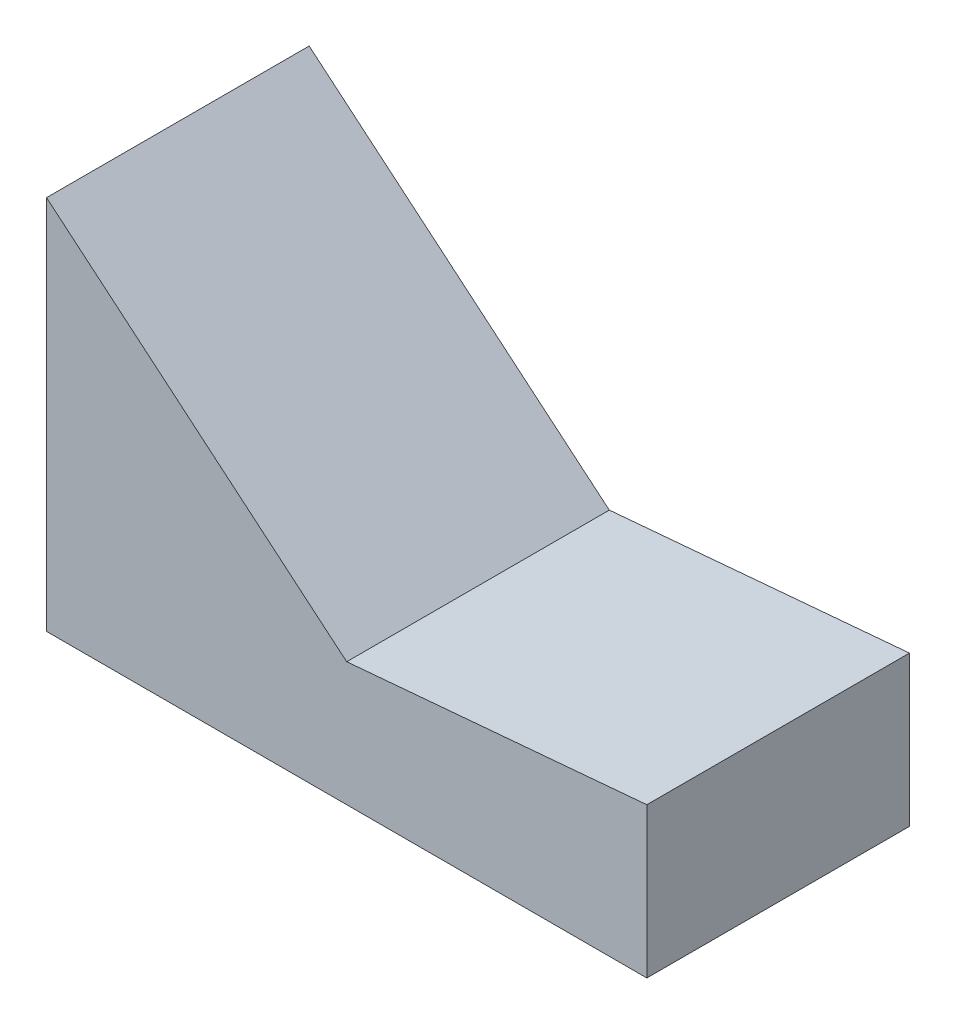
ISO-10303-21;
HEADER;
FILE_DESCRIPTION(('STEP AP214'),'2;1');
FILE_NAME('part.step','',(''),(''),'','','');
FILE_SCHEMA(('AUTOMOTIVE_DESIGN { 1 0 10303 214 1 1 1 1 }'));
ENDSEC;
DATA;
#1=APPLICATION_CONTEXT('core data for automotive mechanical design processes');
#2=APPLICATION_PROTOCOL_DEFINITION('international standard','automotive_design',2000,#1);
#3=PRODUCT_CONTEXT('',#1,'mechanical');
#4=PRODUCT('Part','Part','',(#3));
#5=PRODUCT_RELATED_PRODUCT_CATEGORY('part','',(#4));
#6=PRODUCT_DEFINITION_FORMATION('','',#4);
#7=PRODUCT_DEFINITION_CONTEXT('part definition',#1,'design');
#8=PRODUCT_DEFINITION('design','',#6,#7);
#9=PRODUCT_DEFINITION_SHAPE('','',#8);
#10=(LENGTH_UNIT() NAMED_UNIT(*) SI_UNIT(.MILLI.,.METRE.));
#11=(NAMED_UNIT(*) PLANE_ANGLE_UNIT() SI_UNIT($,.RADIAN.));
#12=(NAMED_UNIT(*) SI_UNIT($,.STERADIAN.) SOLID_ANGLE_UNIT());
#13=UNCERTAINTY_MEASURE_WITH_UNIT(LENGTH_MEASURE(1.E-05),#10,'distance_accuracy_value','');
#14=(GEOMETRIC_REPRESENTATION_CONTEXT(3) GLOBAL_UNCERTAINTY_ASSIGNED_CONTEXT((#13)) GLOBAL_UNIT_ASSIGNED_CONTEXT((#10,
#11,#12)) REPRESENTATION_CONTEXT('',''));
#15=CARTESIAN_POINT('',(0.,0.,0.));
#16=DIRECTION('',(0.,0.,1.));
#17=DIRECTION('',(1.,0.,0.));
#18=AXIS2_PLACEMENT_3D('',#15,#16,#17);
#19=CARTESIAN_POINT('',(40.,0.,17.5));
#20=DIRECTION('',(-1.,0.,0.));
#21=DIRECTION('',(0.,0.,1.));
#22=AXIS2_PLACEMENT_3D('',#19,#20,#21);
#23=PLANE('',#22);
#24=DIRECTION('',(0.,1.,0.));
#25=VECTOR('',#24,1.);
#26=CARTESIAN_POINT('',(40.,0.,-17.5));
#27=LINE('',#26,#25);
#28=CARTESIAN_POINT('',(40.,0.,-17.5));
#29=VERTEX_POINT('',#28);
#30=CARTESIAN_POINT('',(40.,20.,-17.5));
#31=VERTEX_POINT('',#30);
#32=EDGE_CURVE('E107',#29,#31,#27,.T.);
#33=ORIENTED_EDGE('',*,*,#32,.T.);
#34=DIRECTION('',(0.,0.,-1.));
#35=VECTOR('',#34,1.);
#36=CARTESIAN_POINT('',(40.,20.,17.5));
#37=LINE('',#36,#35);
#38=CARTESIAN_POINT('',(40.,20.,17.5));
#39=VERTEX_POINT('',#38);
#40=EDGE_CURVE('E11',#39,#31,#37,.T.);
#41=ORIENTED_EDGE('',*,*,#40,.F.);
#42=DIRECTION('',(0.,1.,0.));
#43=VECTOR('',#42,1.);
#44=CARTESIAN_POINT('',(40.,0.,17.5));
#45=LINE('',#44,#43);
#46=CARTESIAN_POINT('',(40.,0.,17.5));
#47=VERTEX_POINT('',#46);
#48=EDGE_CURVE('E115',#47,#39,#45,.T.);
#49=ORIENTED_EDGE('',*,*,#48,.F.);
#50=DIRECTION('',(0.,0.,-1.));
#51=VECTOR('',#50,1.);
#52=CARTESIAN_POINT('',(40.,0.,17.5));
#53=LINE('',#52,#51);
#54=EDGE_CURVE('E103',#47,#29,#53,.T.);
#55=ORIENTED_EDGE('',*,*,#54,.T.);
#56=EDGE_LOOP('',(#33,#41,#49,#55));
#57=FACE_BOUND('',#56,.T.);
#58=ADVANCED_FACE('F33',(#57),#23,.F.);
#59=CARTESIAN_POINT('',(40.,20.,17.5));
#60=DIRECTION('',(0.0871557427476551,-0.996194698091746,0.));
#61=DIRECTION('',(0.996194698091746,0.0871557427476551,0.));
#62=AXIS2_PLACEMENT_3D('',#59,#60,#61);
#63=PLANE('',#62);
#64=DIRECTION('',(-0.996194698091746,-0.0871557427476551,0.));
#65=VECTOR('',#64,1.);
#66=CARTESIAN_POINT('',(40.,20.,-17.5));
#67=LINE('',#66,#65);
#68=CARTESIAN_POINT('',(0.,16.5004534589632,-17.5));
#69=VERTEX_POINT('',#68);
#70=EDGE_CURVE('E110',#31,#69,#67,.T.);
#71=ORIENTED_EDGE('',*,*,#70,.T.);
#72=DIRECTION('',(0.,0.,-1.));
#73=VECTOR('',#72,1.);
#74=CARTESIAN_POINT('',(0.,16.5004534589632,17.5));
#75=LINE('',#74,#73);
#76=CARTESIAN_POINT('',(0.,16.5004534589632,17.5));
#77=VERTEX_POINT('',#76);
#78=EDGE_CURVE('E41',#77,#69,#75,.T.);
#79=ORIENTED_EDGE('',*,*,#78,.F.);
#80=DIRECTION('',(-0.996194698091746,-0.0871557427476551,0.));
#81=VECTOR('',#80,1.);
#82=CARTESIAN_POINT('',(40.,20.,17.5));
#83=LINE('',#82,#81);
#84=EDGE_CURVE('E83',#39,#77,#83,.T.);
#85=ORIENTED_EDGE('',*,*,#84,.F.);
#86=ORIENTED_EDGE('',*,*,#40,.T.);
#87=EDGE_LOOP('',(#71,#79,#85,#86));
#88=FACE_BOUND('',#87,.T.);
#89=ADVANCED_FACE('F134',(#88),#63,.F.);
#90=CARTESIAN_POINT('',(0.,16.5004534589632,17.5));
#91=DIRECTION('',(-0.642787609686538,-0.766044443118979,0.));
#92=DIRECTION('',(0.766044443118979,-0.642787609686538,0.));
#93=AXIS2_PLACEMENT_3D('',#90,#91,#92);
#94=PLANE('',#93);
#95=DIRECTION('',(-0.766044443118979,0.642787609686538,0.));
#96=VECTOR('',#95,1.);
#97=CARTESIAN_POINT('',(0.,16.5004534589632,-17.5));
#98=LINE('',#97,#96);
#99=CARTESIAN_POINT('',(-40.,50.0644387060543,-17.5));
#100=VERTEX_POINT('',#99);
#101=EDGE_CURVE('E98',#69,#100,#98,.T.);
#102=ORIENTED_EDGE('',*,*,#101,.T.);
#103=DIRECTION('',(0.,0.,-1.));
#104=VECTOR('',#103,1.);
#105=CARTESIAN_POINT('',(-40.,50.0644387060543,17.5));
#106=LINE('',#105,#104);
#107=CARTESIAN_POINT('',(-40.,50.0644387060543,17.5));
#108=VERTEX_POINT('',#107);
#109=EDGE_CURVE('E95',#108,#100,#106,.T.);
#110=ORIENTED_EDGE('',*,*,#109,.F.);
#111=DIRECTION('',(-0.766044443118979,0.642787609686538,0.));
#112=VECTOR('',#111,1.);
#113=CARTESIAN_POINT('',(0.,16.5004534589632,17.5));
#114=LINE('',#113,#112);
#115=EDGE_CURVE('E87',#77,#108,#114,.T.);
#116=ORIENTED_EDGE('',*,*,#115,.F.);
#117=ORIENTED_EDGE('',*,*,#78,.T.);
#118=EDGE_LOOP('',(#102,#110,#116,#117));
#119=FACE_BOUND('',#118,.T.);
#120=ADVANCED_FACE('F96',(#119),#94,.F.);
#121=CARTESIAN_POINT('',(-40.,50.0644387060543,17.5));
#122=DIRECTION('',(1.,0.,0.));
#123=DIRECTION('',(0.,1.,0.));
#124=AXIS2_PLACEMENT_3D('',#121,#122,#123);
#125=PLANE('',#124);
#126=DIRECTION('',(0.,-1.,0.));
#127=VECTOR('',#126,1.);
#128=CARTESIAN_POINT('',(-40.,50.0644387060543,-17.5));
#129=LINE('',#128,#127);
#130=CARTESIAN_POINT('',(-40.,0.,-17.5));
#131=VERTEX_POINT('',#130);
#132=EDGE_CURVE('E69',#100,#131,#129,.T.);
#133=ORIENTED_EDGE('',*,*,#132,.T.);
#134=DIRECTION('',(0.,0.,-1.));
#135=VECTOR('',#134,1.);
#136=CARTESIAN_POINT('',(-40.,0.,17.5));
#137=LINE('',#136,#135);
#138=CARTESIAN_POINT('',(-40.,0.,17.5));
#139=VERTEX_POINT('',#138);
#140=EDGE_CURVE('E99',#139,#131,#137,.T.);
#141=ORIENTED_EDGE('',*,*,#140,.F.);
#142=DIRECTION('',(0.,-1.,0.));
#143=VECTOR('',#142,1.);
#144=CARTESIAN_POINT('',(-40.,50.0644387060543,17.5));
#145=LINE('',#144,#143);
#146=EDGE_CURVE('E91',#108,#139,#145,.T.);
#147=ORIENTED_EDGE('',*,*,#146,.F.);
#148=ORIENTED_EDGE('',*,*,#109,.T.);
#149=EDGE_LOOP('',(#133,#141,#147,#148));
#150=FACE_BOUND('',#149,.T.);
#151=ADVANCED_FACE('F101',(#150),#125,.F.);
#152=CARTESIAN_POINT('',(-40.,0.,17.5));
#153=DIRECTION('',(0.,1.,0.));
#154=DIRECTION('',(-1.,0.,0.));
#155=AXIS2_PLACEMENT_3D('',#152,#153,#154);
#156=PLANE('',#155);
#157=DIRECTION('',(1.,0.,0.));
#158=VECTOR('',#157,1.);
#159=CARTESIAN_POINT('',(-40.,0.,-17.5));
#160=LINE('',#159,#158);
#161=EDGE_CURVE('E75',#131,#29,#160,.T.);
#162=ORIENTED_EDGE('',*,*,#161,.T.);
#163=ORIENTED_EDGE('',*,*,#54,.F.);
#164=DIRECTION('',(1.,0.,0.));
#165=VECTOR('',#164,1.);
#166=CARTESIAN_POINT('',(-40.,0.,17.5));
#167=LINE('',#166,#165);
#168=EDGE_CURVE('E49',#139,#47,#167,.T.);
#169=ORIENTED_EDGE('',*,*,#168,.F.);
#170=ORIENTED_EDGE('',*,*,#140,.T.);
#171=EDGE_LOOP('',(#162,#163,#169,#170));
#172=FACE_BOUND('',#171,.T.);
#173=ADVANCED_FACE('F123',(#172),#156,.F.);
#174=CARTESIAN_POINT('',(0.,0.,17.5));
#175=DIRECTION('',(0.,0.,-1.));
#176=DIRECTION('',(-1.,0.,0.));
#177=AXIS2_PLACEMENT_3D('',#174,#175,#176);
#178=PLANE('',#177);
#179=ORIENTED_EDGE('',*,*,#48,.T.);
#180=ORIENTED_EDGE('',*,*,#84,.T.);
#181=ORIENTED_EDGE('',*,*,#115,.T.);
#182=ORIENTED_EDGE('',*,*,#146,.T.);
#183=ORIENTED_EDGE('',*,*,#168,.T.);
#184=EDGE_LOOP('',(#179,#180,#181,#182,#183));
#185=FACE_BOUND('',#184,.T.);
#186=ADVANCED_FACE('F89',(#185),#178,.F.);
#187=CARTESIAN_POINT('',(0.,0.,-17.5));
#188=DIRECTION('',(0.,0.,-1.));
#189=DIRECTION('',(-1.,0.,0.));
#190=AXIS2_PLACEMENT_3D('',#187,#188,#189);
#191=PLANE('',#190);
#192=ORIENTED_EDGE('',*,*,#32,.F.);
#193=ORIENTED_EDGE('',*,*,#161,.F.);
#194=ORIENTED_EDGE('',*,*,#132,.F.);
#195=ORIENTED_EDGE('',*,*,#101,.F.);
#196=ORIENTED_EDGE('',*,*,#70,.F.);
#197=EDGE_LOOP('',(#192,#193,#194,#195,#196));
#198=FACE_BOUND('',#197,.T.);
#199=ADVANCED_FACE('F119',(#198),#191,.T.);
#200=CLOSED_SHELL('',(#58,#89,#120,#151,#173,#186,#199));
#201=MANIFOLD_SOLID_BREP('B2',#200);
#202=ADVANCED_BREP_SHAPE_REPRESENTATION('',(#18,#201),#14);
#203=SHAPE_DEFINITION_REPRESENTATION(#9,#202);
ENDSEC;
END-ISO-10303-21;
